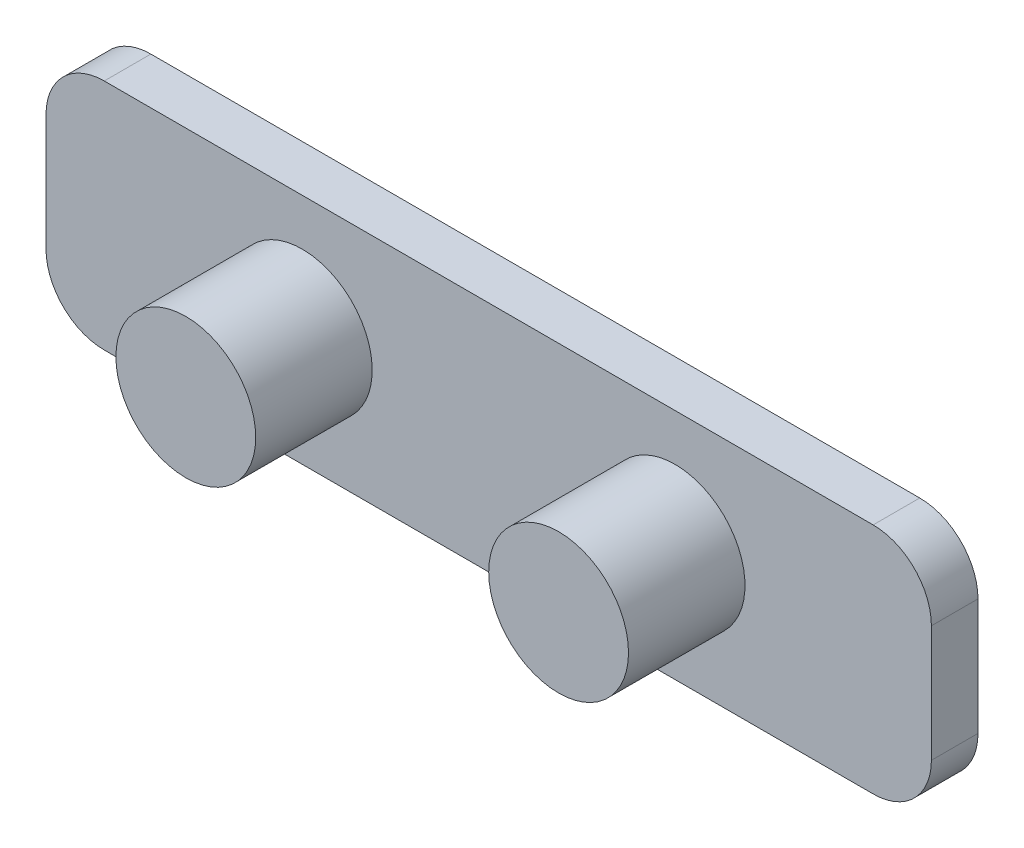
ISO-10303-21;
HEADER;
FILE_DESCRIPTION(('STEP AP214'),'2;1');
FILE_NAME('part.step','',(''),(''),'','','');
FILE_SCHEMA(('AUTOMOTIVE_DESIGN { 1 0 10303 214 1 1 1 1 }'));
ENDSEC;
DATA;
#1=APPLICATION_CONTEXT('core data for automotive mechanical design processes');
#2=APPLICATION_PROTOCOL_DEFINITION('international standard','automotive_design',2000,#1);
#3=PRODUCT_CONTEXT('',#1,'mechanical');
#4=PRODUCT('Part','Part','',(#3));
#5=PRODUCT_RELATED_PRODUCT_CATEGORY('part','',(#4));
#6=PRODUCT_DEFINITION_FORMATION('','',#4);
#7=PRODUCT_DEFINITION_CONTEXT('part definition',#1,'design');
#8=PRODUCT_DEFINITION('design','',#6,#7);
#9=PRODUCT_DEFINITION_SHAPE('','',#8);
#10=(LENGTH_UNIT() NAMED_UNIT(*) SI_UNIT(.MILLI.,.METRE.));
#11=(NAMED_UNIT(*) PLANE_ANGLE_UNIT() SI_UNIT($,.RADIAN.));
#12=(NAMED_UNIT(*) SI_UNIT($,.STERADIAN.) SOLID_ANGLE_UNIT());
#13=UNCERTAINTY_MEASURE_WITH_UNIT(LENGTH_MEASURE(1.E-05),#10,'distance_accuracy_value','');
#14=(GEOMETRIC_REPRESENTATION_CONTEXT(3) GLOBAL_UNCERTAINTY_ASSIGNED_CONTEXT((#13)) GLOBAL_UNIT_ASSIGNED_CONTEXT((#10,
#11,#12)) REPRESENTATION_CONTEXT('',''));
#15=CARTESIAN_POINT('',(0.,0.,0.));
#16=DIRECTION('',(0.,0.,1.));
#17=DIRECTION('',(1.,0.,0.));
#18=AXIS2_PLACEMENT_3D('',#15,#16,#17);
#19=CARTESIAN_POINT('',(-5.31333795137197,1.33941413235611,2.));
#20=DIRECTION('',(0.,0.,-1.));
#21=DIRECTION('',(-1.,0.,0.));
#22=AXIS2_PLACEMENT_3D('',#19,#20,#21);
#23=CYLINDRICAL_SURFACE('',#22,2.5);
#24=CARTESIAN_POINT('',(-5.31333795137197,1.33941413235611,0.));
#25=DIRECTION('',(0.,0.,1.));
#26=DIRECTION('',(-1.,0.,0.));
#27=AXIS2_PLACEMENT_3D('',#24,#25,#26);
#28=CIRCLE('',#27,2.5);
#29=CARTESIAN_POINT('',(-5.31333795137195,3.83941413235611,0.));
#30=VERTEX_POINT('',#29);
#31=CARTESIAN_POINT('',(-7.81333795137197,1.33941413235609,0.));
#32=VERTEX_POINT('',#31);
#33=EDGE_CURVE('E147',#30,#32,#28,.T.);
#34=ORIENTED_EDGE('',*,*,#33,.T.);
#35=DIRECTION('',(0.,0.,-1.));
#36=VECTOR('',#35,1.);
#37=CARTESIAN_POINT('',(-7.81333795137197,1.33941413235609,2.));
#38=LINE('',#37,#36);
#39=CARTESIAN_POINT('',(-7.81333795137197,1.33941413235609,2.));
#40=VERTEX_POINT('',#39);
#41=EDGE_CURVE('E189',#40,#32,#38,.T.);
#42=ORIENTED_EDGE('',*,*,#41,.F.);
#43=CARTESIAN_POINT('',(-5.31333795137197,1.33941413235611,2.));
#44=DIRECTION('',(0.,0.,1.));
#45=DIRECTION('',(-1.,0.,0.));
#46=AXIS2_PLACEMENT_3D('',#43,#44,#45);
#47=CIRCLE('',#46,2.5);
#48=CARTESIAN_POINT('',(-5.31333795137195,3.83941413235611,2.));
#49=VERTEX_POINT('',#48);
#50=EDGE_CURVE('E170',#49,#40,#47,.T.);
#51=ORIENTED_EDGE('',*,*,#50,.F.);
#52=DIRECTION('',(0.,0.,-1.));
#53=VECTOR('',#52,1.);
#54=CARTESIAN_POINT('',(-5.31333795137195,3.83941413235611,2.));
#55=LINE('',#54,#53);
#56=EDGE_CURVE('E143',#49,#30,#55,.T.);
#57=ORIENTED_EDGE('',*,*,#56,.T.);
#58=EDGE_LOOP('',(#34,#42,#51,#57));
#59=FACE_BOUND('',#58,.T.);
#60=ADVANCED_FACE('F45',(#59),#23,.T.);
#61=CARTESIAN_POINT('',(-7.81333795137197,1.33941413235609,2.));
#62=DIRECTION('',(1.,0.,0.));
#63=DIRECTION('',(0.,1.,0.));
#64=AXIS2_PLACEMENT_3D('',#61,#62,#63);
#65=PLANE('',#64);
#66=DIRECTION('',(0.,-1.,0.));
#67=VECTOR('',#66,1.);
#68=CARTESIAN_POINT('',(-7.81333795137197,1.33941413235609,0.));
#69=LINE('',#68,#67);
#70=CARTESIAN_POINT('',(-7.81333795137197,-3.66058586764387,0.));
#71=VERTEX_POINT('',#70);
#72=EDGE_CURVE('E151',#32,#71,#69,.T.);
#73=ORIENTED_EDGE('',*,*,#72,.T.);
#74=DIRECTION('',(0.,0.,-1.));
#75=VECTOR('',#74,1.);
#76=CARTESIAN_POINT('',(-7.81333795137197,-3.66058586764387,2.));
#77=LINE('',#76,#75);
#78=CARTESIAN_POINT('',(-7.81333795137197,-3.66058586764387,2.));
#79=VERTEX_POINT('',#78);
#80=EDGE_CURVE('E185',#79,#71,#77,.T.);
#81=ORIENTED_EDGE('',*,*,#80,.F.);
#82=DIRECTION('',(0.,-1.,0.));
#83=VECTOR('',#82,1.);
#84=CARTESIAN_POINT('',(-7.81333795137197,1.33941413235609,2.));
#85=LINE('',#84,#83);
#86=EDGE_CURVE('E106',#40,#79,#85,.T.);
#87=ORIENTED_EDGE('',*,*,#86,.F.);
#88=ORIENTED_EDGE('',*,*,#41,.T.);
#89=EDGE_LOOP('',(#73,#81,#87,#88));
#90=FACE_BOUND('',#89,.T.);
#91=ADVANCED_FACE('F213',(#90),#65,.F.);
#92=CARTESIAN_POINT('',(-5.31333795137197,-3.66058586764389,2.));
#93=DIRECTION('',(0.,0.,-1.));
#94=DIRECTION('',(-1.,0.,0.));
#95=AXIS2_PLACEMENT_3D('',#92,#93,#94);
#96=CYLINDRICAL_SURFACE('',#95,2.5);
#97=CARTESIAN_POINT('',(-5.31333795137197,-3.66058586764389,0.));
#98=DIRECTION('',(0.,0.,1.));
#99=DIRECTION('',(1.,0.,0.));
#100=AXIS2_PLACEMENT_3D('',#97,#98,#99);
#101=CIRCLE('',#100,2.5);
#102=CARTESIAN_POINT('',(-5.31333795137196,-6.16058586764389,0.));
#103=VERTEX_POINT('',#102);
#104=EDGE_CURVE('E155',#71,#103,#101,.T.);
#105=ORIENTED_EDGE('',*,*,#104,.T.);
#106=DIRECTION('',(0.,0.,-1.));
#107=VECTOR('',#106,1.);
#108=CARTESIAN_POINT('',(-5.31333795137196,-6.16058586764389,2.));
#109=LINE('',#108,#107);
#110=CARTESIAN_POINT('',(-5.31333795137196,-6.16058586764389,2.));
#111=VERTEX_POINT('',#110);
#112=EDGE_CURVE('E181',#111,#103,#109,.T.);
#113=ORIENTED_EDGE('',*,*,#112,.F.);
#114=CARTESIAN_POINT('',(-5.31333795137197,-3.66058586764389,2.));
#115=DIRECTION('',(0.,0.,1.));
#116=DIRECTION('',(1.,0.,0.));
#117=AXIS2_PLACEMENT_3D('',#114,#115,#116);
#118=CIRCLE('',#117,2.5);
#119=EDGE_CURVE('E227',#79,#111,#118,.T.);
#120=ORIENTED_EDGE('',*,*,#119,.F.);
#121=ORIENTED_EDGE('',*,*,#80,.T.);
#122=EDGE_LOOP('',(#105,#113,#120,#121));
#123=FACE_BOUND('',#122,.T.);
#124=ADVANCED_FACE('F218',(#123),#96,.T.);
#125=CARTESIAN_POINT('',(-5.31333795137195,-6.16058586764389,2.));
#126=DIRECTION('',(0.,1.,0.));
#127=DIRECTION('',(0.,0.,1.));
#128=AXIS2_PLACEMENT_3D('',#125,#126,#127);
#129=PLANE('',#128);
#130=DIRECTION('',(1.,0.,0.));
#131=VECTOR('',#130,1.);
#132=CARTESIAN_POINT('',(-5.31333795137195,-6.16058586764389,0.));
#133=LINE('',#132,#131);
#134=CARTESIAN_POINT('',(27.686662048628,-6.16058586764389,0.));
#135=VERTEX_POINT('',#134);
#136=EDGE_CURVE('E158',#103,#135,#133,.T.);
#137=ORIENTED_EDGE('',*,*,#136,.T.);
#138=DIRECTION('',(0.,0.,-1.));
#139=VECTOR('',#138,1.);
#140=CARTESIAN_POINT('',(27.686662048628,-6.16058586764389,2.));
#141=LINE('',#140,#139);
#142=CARTESIAN_POINT('',(27.686662048628,-6.16058586764389,2.));
#143=VERTEX_POINT('',#142);
#144=EDGE_CURVE('E177',#143,#135,#141,.T.);
#145=ORIENTED_EDGE('',*,*,#144,.F.);
#146=DIRECTION('',(1.,0.,0.));
#147=VECTOR('',#146,1.);
#148=CARTESIAN_POINT('',(-5.31333795137195,-6.16058586764389,2.));
#149=LINE('',#148,#147);
#150=EDGE_CURVE('E230',#111,#143,#149,.T.);
#151=ORIENTED_EDGE('',*,*,#150,.F.);
#152=ORIENTED_EDGE('',*,*,#112,.T.);
#153=EDGE_LOOP('',(#137,#145,#151,#152));
#154=FACE_BOUND('',#153,.T.);
#155=ADVANCED_FACE('F320',(#154),#129,.F.);
#156=CARTESIAN_POINT('',(27.686662048628,-3.66058586764389,2.));
#157=DIRECTION('',(0.,0.,-1.));
#158=DIRECTION('',(-1.,0.,0.));
#159=AXIS2_PLACEMENT_3D('',#156,#157,#158);
#160=CYLINDRICAL_SURFACE('',#159,2.5);
#161=CARTESIAN_POINT('',(27.686662048628,-3.66058586764389,0.));
#162=DIRECTION('',(0.,0.,1.));
#163=DIRECTION('',(-1.,0.,0.));
#164=AXIS2_PLACEMENT_3D('',#161,#162,#163);
#165=CIRCLE('',#164,2.5);
#166=CARTESIAN_POINT('',(30.186662048628,-3.66058586764389,0.));
#167=VERTEX_POINT('',#166);
#168=EDGE_CURVE('E161',#135,#167,#165,.T.);
#169=ORIENTED_EDGE('',*,*,#168,.T.);
#170=DIRECTION('',(0.,0.,-1.));
#171=VECTOR('',#170,1.);
#172=CARTESIAN_POINT('',(30.186662048628,-3.66058586764389,2.));
#173=LINE('',#172,#171);
#174=CARTESIAN_POINT('',(30.186662048628,-3.66058586764389,2.));
#175=VERTEX_POINT('',#174);
#176=EDGE_CURVE('E136',#175,#167,#173,.T.);
#177=ORIENTED_EDGE('',*,*,#176,.F.);
#178=CARTESIAN_POINT('',(27.686662048628,-3.66058586764389,2.));
#179=DIRECTION('',(0.,0.,1.));
#180=DIRECTION('',(-1.,0.,0.));
#181=AXIS2_PLACEMENT_3D('',#178,#179,#180);
#182=CIRCLE('',#181,2.5);
#183=EDGE_CURVE('E125',#143,#175,#182,.T.);
#184=ORIENTED_EDGE('',*,*,#183,.F.);
#185=ORIENTED_EDGE('',*,*,#144,.T.);
#186=EDGE_LOOP('',(#169,#177,#184,#185));
#187=FACE_BOUND('',#186,.T.);
#188=ADVANCED_FACE('F312',(#187),#160,.T.);
#189=CARTESIAN_POINT('',(30.186662048628,1.33941413235611,2.));
#190=DIRECTION('',(-1.,0.,0.));
#191=DIRECTION('',(0.,-1.,0.));
#192=AXIS2_PLACEMENT_3D('',#189,#190,#191);
#193=PLANE('',#192);
#194=DIRECTION('',(0.,1.,0.));
#195=VECTOR('',#194,1.);
#196=CARTESIAN_POINT('',(30.186662048628,1.33941413235611,0.));
#197=LINE('',#196,#195);
#198=CARTESIAN_POINT('',(30.186662048628,1.33941413235611,0.));
#199=VERTEX_POINT('',#198);
#200=EDGE_CURVE('E134',#167,#199,#197,.T.);
#201=ORIENTED_EDGE('',*,*,#200,.T.);
#202=DIRECTION('',(0.,0.,-1.));
#203=VECTOR('',#202,1.);
#204=CARTESIAN_POINT('',(30.186662048628,1.33941413235611,2.));
#205=LINE('',#204,#203);
#206=CARTESIAN_POINT('',(30.186662048628,1.33941413235611,2.));
#207=VERTEX_POINT('',#206);
#208=EDGE_CURVE('E131',#207,#199,#205,.T.);
#209=ORIENTED_EDGE('',*,*,#208,.F.);
#210=DIRECTION('',(0.,1.,0.));
#211=VECTOR('',#210,1.);
#212=CARTESIAN_POINT('',(30.186662048628,1.33941413235611,2.));
#213=LINE('',#212,#211);
#214=EDGE_CURVE('E119',#175,#207,#213,.T.);
#215=ORIENTED_EDGE('',*,*,#214,.F.);
#216=ORIENTED_EDGE('',*,*,#176,.T.);
#217=EDGE_LOOP('',(#201,#209,#215,#216));
#218=FACE_BOUND('',#217,.T.);
#219=ADVANCED_FACE('F132',(#218),#193,.F.);
#220=CARTESIAN_POINT('',(27.686662048628,1.33941413235611,2.));
#221=DIRECTION('',(0.,0.,-1.));
#222=DIRECTION('',(-1.,0.,0.));
#223=AXIS2_PLACEMENT_3D('',#220,#221,#222);
#224=CYLINDRICAL_SURFACE('',#223,2.5);
#225=CARTESIAN_POINT('',(27.686662048628,1.33941413235611,0.));
#226=DIRECTION('',(0.,0.,1.));
#227=DIRECTION('',(1.,0.,0.));
#228=AXIS2_PLACEMENT_3D('',#225,#226,#227);
#229=CIRCLE('',#228,2.5);
#230=CARTESIAN_POINT('',(27.686662048628,3.83941413235611,0.));
#231=VERTEX_POINT('',#230);
#232=EDGE_CURVE('E91',#199,#231,#229,.T.);
#233=ORIENTED_EDGE('',*,*,#232,.T.);
#234=DIRECTION('',(0.,0.,-1.));
#235=VECTOR('',#234,1.);
#236=CARTESIAN_POINT('',(27.686662048628,3.83941413235611,2.));
#237=LINE('',#236,#235);
#238=CARTESIAN_POINT('',(27.686662048628,3.83941413235611,2.));
#239=VERTEX_POINT('',#238);
#240=EDGE_CURVE('E137',#239,#231,#237,.T.);
#241=ORIENTED_EDGE('',*,*,#240,.F.);
#242=CARTESIAN_POINT('',(27.686662048628,1.33941413235611,2.));
#243=DIRECTION('',(0.,0.,1.));
#244=DIRECTION('',(1.,0.,0.));
#245=AXIS2_PLACEMENT_3D('',#242,#243,#244);
#246=CIRCLE('',#245,2.5);
#247=EDGE_CURVE('E123',#207,#239,#246,.T.);
#248=ORIENTED_EDGE('',*,*,#247,.F.);
#249=ORIENTED_EDGE('',*,*,#208,.T.);
#250=EDGE_LOOP('',(#233,#241,#248,#249));
#251=FACE_BOUND('',#250,.T.);
#252=ADVANCED_FACE('F139',(#251),#224,.T.);
#253=CARTESIAN_POINT('',(-5.31333795137195,3.83941413235611,2.));
#254=DIRECTION('',(0.,-1.,0.));
#255=DIRECTION('',(1.,0.,0.));
#256=AXIS2_PLACEMENT_3D('',#253,#254,#255);
#257=PLANE('',#256);
#258=DIRECTION('',(-1.,0.,0.));
#259=VECTOR('',#258,1.);
#260=CARTESIAN_POINT('',(-5.31333795137195,3.83941413235611,0.));
#261=LINE('',#260,#259);
#262=EDGE_CURVE('E97',#231,#30,#261,.T.);
#263=ORIENTED_EDGE('',*,*,#262,.T.);
#264=ORIENTED_EDGE('',*,*,#56,.F.);
#265=DIRECTION('',(-1.,0.,0.));
#266=VECTOR('',#265,1.);
#267=CARTESIAN_POINT('',(-5.31333795137195,3.83941413235611,2.));
#268=LINE('',#267,#266);
#269=EDGE_CURVE('E62',#239,#49,#268,.T.);
#270=ORIENTED_EDGE('',*,*,#269,.F.);
#271=ORIENTED_EDGE('',*,*,#240,.T.);
#272=EDGE_LOOP('',(#263,#264,#270,#271));
#273=FACE_BOUND('',#272,.T.);
#274=ADVANCED_FACE('F199',(#273),#257,.F.);
#275=CARTESIAN_POINT('',(-5.31333795137197,1.33941413235611,2.));
#276=DIRECTION('',(0.,0.,-1.));
#277=DIRECTION('',(-1.,0.,0.));
#278=AXIS2_PLACEMENT_3D('',#275,#276,#277);
#279=PLANE('',#278);
#280=CARTESIAN_POINT('',(3.18666204862802,-1.16058586764389,2.));
#281=DIRECTION('',(0.,0.,-1.));
#282=DIRECTION('',(-1.,0.,0.));
#283=AXIS2_PLACEMENT_3D('',#280,#281,#282);
#284=CIRCLE('',#283,3.);
#285=CARTESIAN_POINT('',(0.186662048628022,-1.16058586764389,2.));
#286=VERTEX_POINT('',#285);
#287=EDGE_CURVE('E11',#286,#286,#284,.F.);
#288=ORIENTED_EDGE('',*,*,#287,.F.);
#289=EDGE_LOOP('',(#288));
#290=FACE_BOUND('',#289,.T.);
#291=CARTESIAN_POINT('',(19.186662048628,-1.16058586764389,2.));
#292=DIRECTION('',(0.,0.,-1.));
#293=DIRECTION('',(-1.,0.,0.));
#294=AXIS2_PLACEMENT_3D('',#291,#292,#293);
#295=CIRCLE('',#294,3.);
#296=CARTESIAN_POINT('',(16.186662048628,-1.16058586764389,2.));
#297=VERTEX_POINT('',#296);
#298=EDGE_CURVE('E54',#297,#297,#295,.F.);
#299=ORIENTED_EDGE('',*,*,#298,.F.);
#300=EDGE_LOOP('',(#299));
#301=FACE_BOUND('',#300,.T.);
#302=ORIENTED_EDGE('',*,*,#50,.T.);
#303=ORIENTED_EDGE('',*,*,#86,.T.);
#304=ORIENTED_EDGE('',*,*,#119,.T.);
#305=ORIENTED_EDGE('',*,*,#150,.T.);
#306=ORIENTED_EDGE('',*,*,#183,.T.);
#307=ORIENTED_EDGE('',*,*,#214,.T.);
#308=ORIENTED_EDGE('',*,*,#247,.T.);
#309=ORIENTED_EDGE('',*,*,#269,.T.);
#310=EDGE_LOOP('',(#302,#303,#304,#305,#306,#307,#308,#309));
#311=FACE_BOUND('',#310,.T.);
#312=ADVANCED_FACE('F121',(#290,#301,#311),#279,.F.);
#313=CARTESIAN_POINT('',(-5.31333795137197,1.33941413235611,0.));
#314=DIRECTION('',(0.,0.,-1.));
#315=DIRECTION('',(-1.,0.,0.));
#316=AXIS2_PLACEMENT_3D('',#313,#314,#315);
#317=PLANE('',#316);
#318=ORIENTED_EDGE('',*,*,#33,.F.);
#319=ORIENTED_EDGE('',*,*,#262,.F.);
#320=ORIENTED_EDGE('',*,*,#232,.F.);
#321=ORIENTED_EDGE('',*,*,#200,.F.);
#322=ORIENTED_EDGE('',*,*,#168,.F.);
#323=ORIENTED_EDGE('',*,*,#136,.F.);
#324=ORIENTED_EDGE('',*,*,#104,.F.);
#325=ORIENTED_EDGE('',*,*,#72,.F.);
#326=EDGE_LOOP('',(#318,#319,#320,#321,#322,#323,#324,#325));
#327=FACE_BOUND('',#326,.T.);
#328=ADVANCED_FACE('F198',(#327),#317,.T.);
#329=CARTESIAN_POINT('',(19.186662048628,-1.16058586764389,7.));
#330=DIRECTION('',(0.,0.,-1.));
#331=DIRECTION('',(-1.,0.,0.));
#332=AXIS2_PLACEMENT_3D('',#329,#330,#331);
#333=CYLINDRICAL_SURFACE('',#332,3.);
#334=CARTESIAN_POINT('',(19.186662048628,-1.16058586764389,7.));
#335=DIRECTION('',(0.,0.,1.));
#336=DIRECTION('',(1.,0.,0.));
#337=AXIS2_PLACEMENT_3D('',#334,#335,#336);
#338=CIRCLE('',#337,3.);
#339=CARTESIAN_POINT('',(22.186662048628,-1.16058586764389,7.));
#340=VERTEX_POINT('',#339);
#341=EDGE_CURVE('E240',#340,#340,#338,.T.);
#342=ORIENTED_EDGE('',*,*,#341,.F.);
#343=EDGE_LOOP('',(#342));
#344=FACE_BOUND('',#343,.T.);
#345=ORIENTED_EDGE('',*,*,#298,.T.);
#346=EDGE_LOOP('',(#345));
#347=FACE_BOUND('',#346,.T.);
#348=ADVANCED_FACE('F195',(#344,#347),#333,.T.);
#349=CARTESIAN_POINT('',(19.186662048628,-1.16058586764389,7.));
#350=DIRECTION('',(0.,0.,1.));
#351=DIRECTION('',(1.,0.,0.));
#352=AXIS2_PLACEMENT_3D('',#349,#350,#351);
#353=PLANE('',#352);
#354=ORIENTED_EDGE('',*,*,#341,.T.);
#355=EDGE_LOOP('',(#354));
#356=FACE_BOUND('',#355,.T.);
#357=ADVANCED_FACE('F253',(#356),#353,.T.);
#358=CARTESIAN_POINT('',(3.18666204862802,-1.16058586764389,7.));
#359=DIRECTION('',(0.,0.,-1.));
#360=DIRECTION('',(-1.,0.,0.));
#361=AXIS2_PLACEMENT_3D('',#358,#359,#360);
#362=CYLINDRICAL_SURFACE('',#361,3.);
#363=CARTESIAN_POINT('',(3.18666204862802,-1.16058586764389,7.));
#364=DIRECTION('',(0.,0.,1.));
#365=DIRECTION('',(1.,0.,0.));
#366=AXIS2_PLACEMENT_3D('',#363,#364,#365);
#367=CIRCLE('',#366,3.);
#368=CARTESIAN_POINT('',(6.18666204862803,-1.16058586764389,7.));
#369=VERTEX_POINT('',#368);
#370=EDGE_CURVE('E152',#369,#369,#367,.T.);
#371=ORIENTED_EDGE('',*,*,#370,.F.);
#372=EDGE_LOOP('',(#371));
#373=FACE_BOUND('',#372,.T.);
#374=ORIENTED_EDGE('',*,*,#287,.T.);
#375=EDGE_LOOP('',(#374));
#376=FACE_BOUND('',#375,.T.);
#377=ADVANCED_FACE('F250',(#373,#376),#362,.T.);
#378=CARTESIAN_POINT('',(3.18666204862802,-1.16058586764389,7.));
#379=DIRECTION('',(0.,0.,1.));
#380=DIRECTION('',(1.,0.,0.));
#381=AXIS2_PLACEMENT_3D('',#378,#379,#380);
#382=PLANE('',#381);
#383=ORIENTED_EDGE('',*,*,#370,.T.);
#384=EDGE_LOOP('',(#383));
#385=FACE_BOUND('',#384,.T.);
#386=ADVANCED_FACE('F248',(#385),#382,.T.);
#387=CLOSED_SHELL('',(#60,#91,#124,#155,#188,#219,#252,#274,#312,#328,#348,#357,#377,#386));
#388=MANIFOLD_SOLID_BREP('B2',#387);
#389=ADVANCED_BREP_SHAPE_REPRESENTATION('',(#18,#388),#14);
#390=SHAPE_DEFINITION_REPRESENTATION(#9,#389);
ENDSEC;
END-ISO-10303-21;
